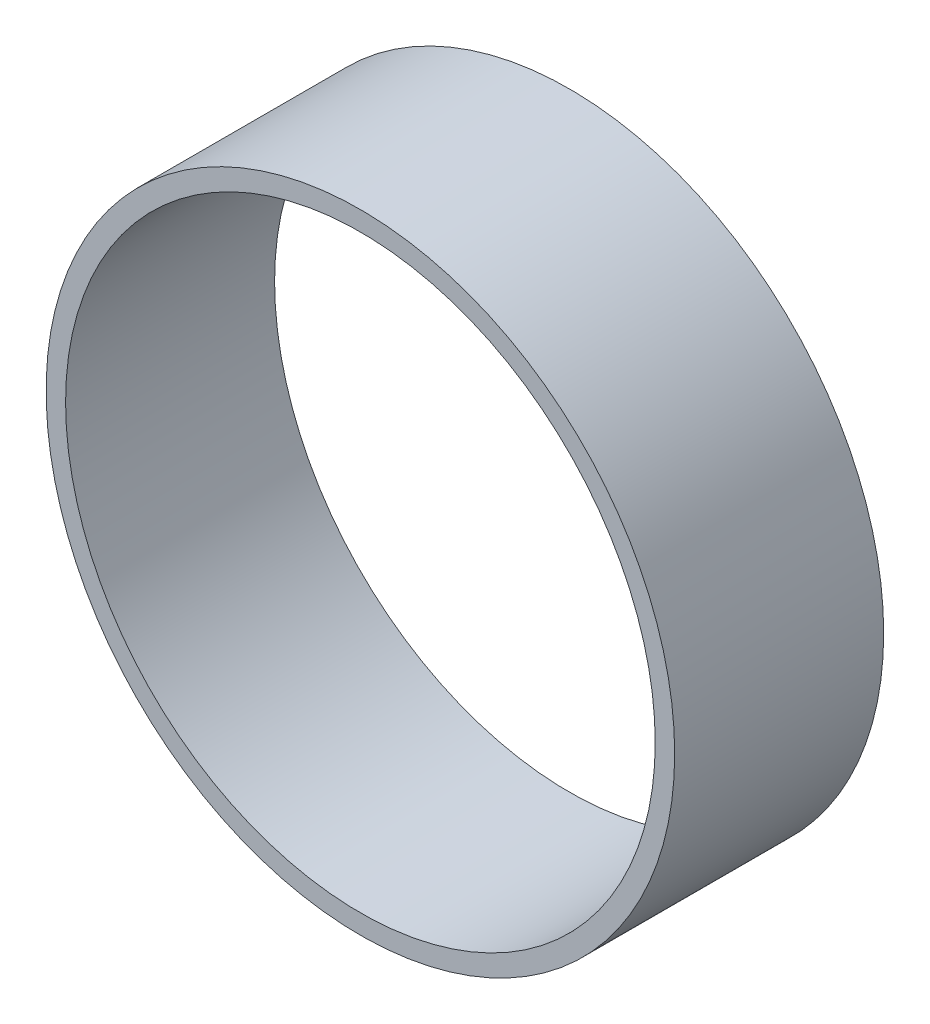
ISO-10303-21;
HEADER;
FILE_DESCRIPTION(('STEP AP214'),'2;1');
FILE_NAME('part.step','',(''),(''),'','','');
FILE_SCHEMA(('AUTOMOTIVE_DESIGN { 1 0 10303 214 1 1 1 1 }'));
ENDSEC;
DATA;
#1=APPLICATION_CONTEXT('core data for automotive mechanical design processes');
#2=APPLICATION_PROTOCOL_DEFINITION('international standard','automotive_design',2000,#1);
#3=PRODUCT_CONTEXT('',#1,'mechanical');
#4=PRODUCT('Part','Part','',(#3));
#5=PRODUCT_RELATED_PRODUCT_CATEGORY('part','',(#4));
#6=PRODUCT_DEFINITION_FORMATION('','',#4);
#7=PRODUCT_DEFINITION_CONTEXT('part definition',#1,'design');
#8=PRODUCT_DEFINITION('design','',#6,#7);
#9=PRODUCT_DEFINITION_SHAPE('','',#8);
#10=(LENGTH_UNIT() NAMED_UNIT(*) SI_UNIT(.MILLI.,.METRE.));
#11=(NAMED_UNIT(*) PLANE_ANGLE_UNIT() SI_UNIT($,.RADIAN.));
#12=(NAMED_UNIT(*) SI_UNIT($,.STERADIAN.) SOLID_ANGLE_UNIT());
#13=UNCERTAINTY_MEASURE_WITH_UNIT(LENGTH_MEASURE(1.E-05),#10,'distance_accuracy_value','');
#14=(GEOMETRIC_REPRESENTATION_CONTEXT(3) GLOBAL_UNCERTAINTY_ASSIGNED_CONTEXT((#13)) GLOBAL_UNIT_ASSIGNED_CONTEXT((#10,
#11,#12)) REPRESENTATION_CONTEXT('',''));
#15=CARTESIAN_POINT('',(0.,0.,0.));
#16=DIRECTION('',(0.,0.,1.));
#17=DIRECTION('',(1.,0.,0.));
#18=AXIS2_PLACEMENT_3D('',#15,#16,#17);
#19=CARTESIAN_POINT('',(0.,0.,10.74));
#20=DIRECTION('',(0.,0.,1.));
#21=DIRECTION('',(1.,0.,0.));
#22=AXIS2_PLACEMENT_3D('',#19,#20,#21);
#23=PLANE('',#22);
#24=CARTESIAN_POINT('',(0.,0.,10.74));
#25=DIRECTION('',(0.,0.,1.));
#26=DIRECTION('',(1.,0.,0.));
#27=AXIS2_PLACEMENT_3D('',#24,#25,#26);
#28=CIRCLE('',#27,16.15);
#29=CARTESIAN_POINT('',(16.15,0.,10.74));
#30=VERTEX_POINT('',#29);
#31=EDGE_CURVE('E11',#30,#30,#28,.T.);
#32=ORIENTED_EDGE('',*,*,#31,.T.);
#33=EDGE_LOOP('',(#32));
#34=FACE_BOUND('',#33,.T.);
#35=CARTESIAN_POINT('',(0.,0.,10.74));
#36=DIRECTION('',(0.,0.,1.));
#37=DIRECTION('',(1.,0.,0.));
#38=AXIS2_PLACEMENT_3D('',#35,#36,#37);
#39=CIRCLE('',#38,15.15);
#40=CARTESIAN_POINT('',(15.15,0.,10.74));
#41=VERTEX_POINT('',#40);
#42=EDGE_CURVE('E60',#41,#41,#39,.T.);
#43=ORIENTED_EDGE('',*,*,#42,.F.);
#44=EDGE_LOOP('',(#43));
#45=FACE_BOUND('',#44,.T.);
#46=ADVANCED_FACE('F47',(#34,#45),#23,.T.);
#47=CARTESIAN_POINT('',(0.,0.,0.));
#48=DIRECTION('',(0.,0.,1.));
#49=DIRECTION('',(1.,0.,0.));
#50=AXIS2_PLACEMENT_3D('',#47,#48,#49);
#51=PLANE('',#50);
#52=CARTESIAN_POINT('',(0.,0.,0.));
#53=DIRECTION('',(0.,0.,1.));
#54=DIRECTION('',(1.,0.,0.));
#55=AXIS2_PLACEMENT_3D('',#52,#53,#54);
#56=CIRCLE('',#55,16.15);
#57=CARTESIAN_POINT('',(16.15,0.,0.));
#58=VERTEX_POINT('',#57);
#59=EDGE_CURVE('E51',#58,#58,#56,.T.);
#60=ORIENTED_EDGE('',*,*,#59,.F.);
#61=EDGE_LOOP('',(#60));
#62=FACE_BOUND('',#61,.T.);
#63=CARTESIAN_POINT('',(0.,0.,0.));
#64=DIRECTION('',(0.,0.,1.));
#65=DIRECTION('',(1.,0.,0.));
#66=AXIS2_PLACEMENT_3D('',#63,#64,#65);
#67=CIRCLE('',#66,15.15);
#68=CARTESIAN_POINT('',(15.15,0.,0.));
#69=VERTEX_POINT('',#68);
#70=EDGE_CURVE('E62',#69,#69,#67,.T.);
#71=ORIENTED_EDGE('',*,*,#70,.T.);
#72=EDGE_LOOP('',(#71));
#73=FACE_BOUND('',#72,.T.);
#74=ADVANCED_FACE('F74',(#62,#73),#51,.F.);
#75=CARTESIAN_POINT('',(0.,0.,10.74));
#76=DIRECTION('',(0.,0.,-1.));
#77=DIRECTION('',(-1.,0.,0.));
#78=AXIS2_PLACEMENT_3D('',#75,#76,#77);
#79=CYLINDRICAL_SURFACE('',#78,16.15);
#80=ORIENTED_EDGE('',*,*,#31,.F.);
#81=EDGE_LOOP('',(#80));
#82=FACE_BOUND('',#81,.T.);
#83=ORIENTED_EDGE('',*,*,#59,.T.);
#84=EDGE_LOOP('',(#83));
#85=FACE_BOUND('',#84,.T.);
#86=ADVANCED_FACE('F49',(#82,#85),#79,.T.);
#87=CARTESIAN_POINT('',(0.,0.,10.74));
#88=DIRECTION('',(0.,0.,-1.));
#89=DIRECTION('',(-1.,0.,0.));
#90=AXIS2_PLACEMENT_3D('',#87,#88,#89);
#91=CYLINDRICAL_SURFACE('',#90,15.15);
#92=ORIENTED_EDGE('',*,*,#42,.T.);
#93=EDGE_LOOP('',(#92));
#94=FACE_BOUND('',#93,.T.);
#95=ORIENTED_EDGE('',*,*,#70,.F.);
#96=EDGE_LOOP('',(#95));
#97=FACE_BOUND('',#96,.T.);
#98=ADVANCED_FACE('F70',(#94,#97),#91,.F.);
#99=CLOSED_SHELL('',(#46,#74,#86,#98));
#100=MANIFOLD_SOLID_BREP('B2',#99);
#101=ADVANCED_BREP_SHAPE_REPRESENTATION('',(#18,#100),#14);
#102=SHAPE_DEFINITION_REPRESENTATION(#9,#101);
ENDSEC;
END-ISO-10303-21;
